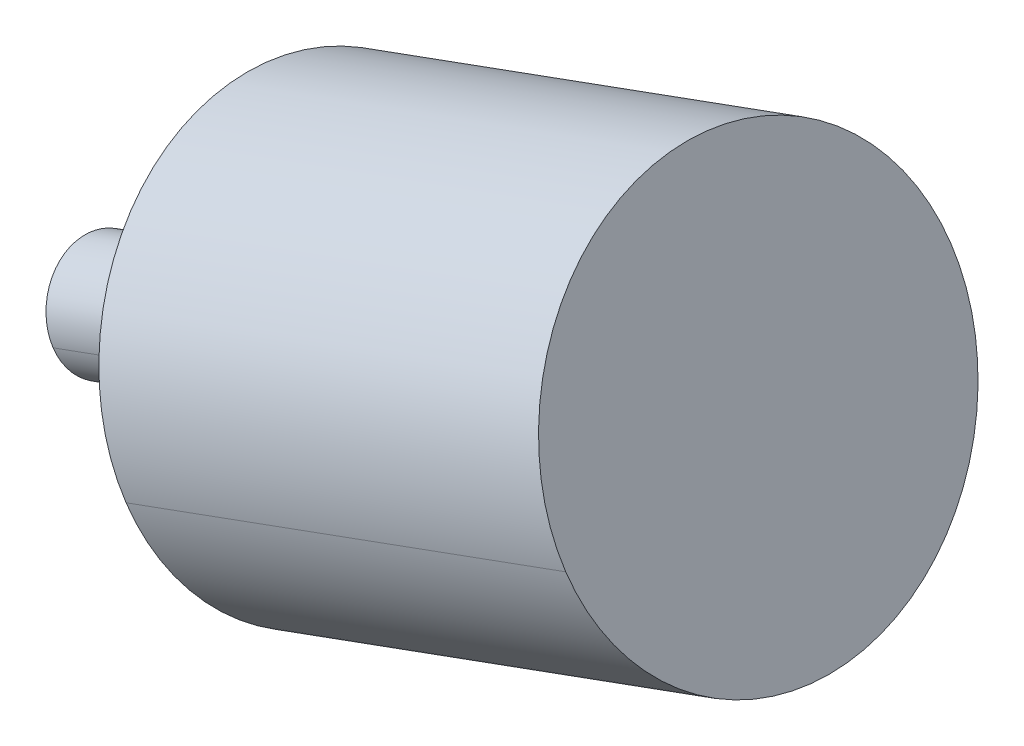
ISO-10303-21;
HEADER;
FILE_DESCRIPTION(('STEP AP214'),'2;1');
FILE_NAME('part.step','',(''),(''),'','','');
FILE_SCHEMA(('AUTOMOTIVE_DESIGN { 1 0 10303 214 1 1 1 1 }'));
ENDSEC;
DATA;
#1=APPLICATION_CONTEXT('core data for automotive mechanical design processes');
#2=APPLICATION_PROTOCOL_DEFINITION('international standard','automotive_design',2000,#1);
#3=PRODUCT_CONTEXT('',#1,'mechanical');
#4=PRODUCT('Part','Part','',(#3));
#5=PRODUCT_RELATED_PRODUCT_CATEGORY('part','',(#4));
#6=PRODUCT_DEFINITION_FORMATION('','',#4);
#7=PRODUCT_DEFINITION_CONTEXT('part definition',#1,'design');
#8=PRODUCT_DEFINITION('design','',#6,#7);
#9=PRODUCT_DEFINITION_SHAPE('','',#8);
#10=(LENGTH_UNIT() NAMED_UNIT(*) SI_UNIT(.MILLI.,.METRE.));
#11=(NAMED_UNIT(*) PLANE_ANGLE_UNIT() SI_UNIT($,.RADIAN.));
#12=(NAMED_UNIT(*) SI_UNIT($,.STERADIAN.) SOLID_ANGLE_UNIT());
#13=UNCERTAINTY_MEASURE_WITH_UNIT(LENGTH_MEASURE(1.E-05),#10,'distance_accuracy_value','');
#14=(GEOMETRIC_REPRESENTATION_CONTEXT(3) GLOBAL_UNCERTAINTY_ASSIGNED_CONTEXT((#13)) GLOBAL_UNIT_ASSIGNED_CONTEXT((#10,
#11,#12)) REPRESENTATION_CONTEXT('',''));
#15=CARTESIAN_POINT('',(0.,0.,0.));
#16=DIRECTION('',(0.,0.,1.));
#17=DIRECTION('',(1.,0.,0.));
#18=AXIS2_PLACEMENT_3D('',#15,#16,#17);
#19=CARTESIAN_POINT('',(1.21636447513984,17.2970954989233,255.59864258433));
#20=DIRECTION('',(0.93969262078591,0.342020143325663,0.));
#21=DIRECTION('',(-0.0590336096404953,0.162193509476162,-0.984991522002408));
#22=AXIS2_PLACEMENT_3D('',#19,#20,#21);
#23=CYLINDRICAL_SURFACE('',#22,5.25);
#24=CARTESIAN_POINT('',(1.21636447513984,17.2970954989233,255.59864258433));
#25=DIRECTION('',(-0.93969262078591,-0.342020143325663,0.));
#26=DIRECTION('',(0.0590336096404953,-0.162193509476162,0.984991522002408));
#27=AXIS2_PLACEMENT_3D('',#24,#25,#26);
#28=CIRCLE('',#27,5.25);
#29=CARTESIAN_POINT('',(1.52629092575245,16.4455795741735,260.769848074843));
#30=VERTEX_POINT('',#29);
#31=CARTESIAN_POINT('',(0.906438024527237,18.1486114236732,250.427437093817));
#32=VERTEX_POINT('',#31);
#33=EDGE_CURVE('E67',#30,#32,#28,.T.);
#34=ORIENTED_EDGE('',*,*,#33,.F.);
#35=DIRECTION('',(0.93969262078591,0.342020143325663,0.));
#36=VECTOR('',#35,1.);
#37=CARTESIAN_POINT('',(1.52629092575245,16.4455795741735,260.769848074843));
#38=LINE('',#37,#36);
#39=CARTESIAN_POINT('',(16.561372858327,21.9179018673841,260.769848074843));
#40=VERTEX_POINT('',#39);
#41=EDGE_CURVE('E11',#30,#40,#38,.T.);
#42=ORIENTED_EDGE('',*,*,#41,.T.);
#43=CARTESIAN_POINT('',(16.2514464077144,22.7694177921339,255.59864258433));
#44=DIRECTION('',(-0.93969262078591,-0.342020143325663,0.));
#45=DIRECTION('',(0.0590336096404953,-0.162193509476162,0.984991522002408));
#46=AXIS2_PLACEMENT_3D('',#43,#44,#45);
#47=CIRCLE('',#46,5.25);
#48=CARTESIAN_POINT('',(15.9415199571018,23.6209337168838,250.427437093817));
#49=VERTEX_POINT('',#48);
#50=EDGE_CURVE('E55',#40,#49,#47,.T.);
#51=ORIENTED_EDGE('',*,*,#50,.T.);
#52=DIRECTION('',(0.93969262078591,0.342020143325663,0.));
#53=VECTOR('',#52,1.);
#54=CARTESIAN_POINT('',(0.906438024527237,18.1486114236732,250.427437093817));
#55=LINE('',#54,#53);
#56=EDGE_CURVE('E161',#32,#49,#55,.T.);
#57=ORIENTED_EDGE('',*,*,#56,.F.);
#58=EDGE_LOOP('',(#34,#42,#51,#57));
#59=FACE_BOUND('',#58,.T.);
#60=ADVANCED_FACE('F44',(#59),#23,.T.);
#61=CARTESIAN_POINT('',(16.2514464077144,22.7694177921339,255.59864258433));
#62=DIRECTION('',(0.93969262078591,0.342020143325663,0.));
#63=DIRECTION('',(-0.0590336096404953,0.162193509476162,-0.984991522002408));
#64=AXIS2_PLACEMENT_3D('',#61,#62,#63);
#65=CYLINDRICAL_SURFACE('',#64,6.);
#66=CARTESIAN_POINT('',(16.2514464077144,22.7694177921339,255.59864258433));
#67=DIRECTION('',(-0.93969262078591,-0.342020143325663,0.));
#68=DIRECTION('',(0.0590336096404953,-0.162193509476162,0.984991522002408));
#69=AXIS2_PLACEMENT_3D('',#66,#67,#68);
#70=CIRCLE('',#69,6.);
#71=CARTESIAN_POINT('',(16.6056480655574,21.796256735277,261.508591716344));
#72=VERTEX_POINT('',#71);
#73=CARTESIAN_POINT('',(15.8972447498714,23.7425788489909,249.688693452316));
#74=VERTEX_POINT('',#73);
#75=EDGE_CURVE('E86',#72,#74,#70,.T.);
#76=ORIENTED_EDGE('',*,*,#75,.F.);
#77=DIRECTION('',(0.93969262078591,0.342020143325663,0.));
#78=VECTOR('',#77,1.);
#79=CARTESIAN_POINT('',(16.6056480655574,21.796256735277,261.508591716344));
#80=LINE('',#79,#78);
#81=CARTESIAN_POINT('',(22.2438037902729,23.8483775952309,261.508591716344));
#82=VERTEX_POINT('',#81);
#83=EDGE_CURVE('E179',#72,#82,#80,.T.);
#84=ORIENTED_EDGE('',*,*,#83,.T.);
#85=CARTESIAN_POINT('',(21.8896021324299,24.8215386520879,255.59864258433));
#86=DIRECTION('',(-0.93969262078591,-0.342020143325663,0.));
#87=DIRECTION('',(0.0590336096404953,-0.162193509476162,0.984991522002408));
#88=AXIS2_PLACEMENT_3D('',#85,#86,#87);
#89=CIRCLE('',#88,6.);
#90=CARTESIAN_POINT('',(21.5354004745869,25.7946997089449,249.688693452316));
#91=VERTEX_POINT('',#90);
#92=EDGE_CURVE('E100',#82,#91,#89,.T.);
#93=ORIENTED_EDGE('',*,*,#92,.T.);
#94=DIRECTION('',(0.93969262078591,0.342020143325663,0.));
#95=VECTOR('',#94,1.);
#96=CARTESIAN_POINT('',(15.8972447498714,23.7425788489909,249.688693452316));
#97=LINE('',#96,#95);
#98=EDGE_CURVE('E160',#74,#91,#97,.T.);
#99=ORIENTED_EDGE('',*,*,#98,.F.);
#100=EDGE_LOOP('',(#76,#84,#93,#99));
#101=FACE_BOUND('',#100,.T.);
#102=ADVANCED_FACE('F213',(#101),#65,.T.);
#103=CARTESIAN_POINT('',(21.8896021324299,24.8215386520879,255.59864258433));
#104=DIRECTION('',(0.93969262078591,0.342020143325663,0.));
#105=DIRECTION('',(-0.0590336096404953,0.162193509476162,-0.984991522002408));
#106=AXIS2_PLACEMENT_3D('',#103,#104,#105);
#107=CYLINDRICAL_SURFACE('',#106,20.);
#108=CARTESIAN_POINT('',(21.8896021324299,24.8215386520879,255.59864258433));
#109=DIRECTION('',(-0.93969262078591,-0.342020143325663,0.));
#110=DIRECTION('',(0.0590336096404953,-0.162193509476162,0.984991522002408));
#111=AXIS2_PLACEMENT_3D('',#108,#109,#110);
#112=CIRCLE('',#111,20.);
#113=CARTESIAN_POINT('',(23.0702743252398,21.5776684625647,275.298473024378));
#114=VERTEX_POINT('',#113);
#115=CARTESIAN_POINT('',(20.70892993962,28.0654088416112,235.898812144282));
#116=VERTEX_POINT('',#115);
#117=EDGE_CURVE('E138',#114,#116,#112,.T.);
#118=ORIENTED_EDGE('',*,*,#117,.F.);
#119=DIRECTION('',(0.93969262078591,0.342020143325663,0.));
#120=VECTOR('',#119,1.);
#121=CARTESIAN_POINT('',(23.0702743252398,21.5776684625647,275.298473024378));
#122=LINE('',#121,#120);
#123=CARTESIAN_POINT('',(65.3564422606057,36.9685749122195,275.298473024378));
#124=VERTEX_POINT('',#123);
#125=EDGE_CURVE('E134',#114,#124,#122,.T.);
#126=ORIENTED_EDGE('',*,*,#125,.T.);
#127=CARTESIAN_POINT('',(64.1757700677958,40.2124451017428,255.59864258433));
#128=DIRECTION('',(-0.93969262078591,-0.342020143325663,0.));
#129=DIRECTION('',(0.0590336096404953,-0.162193509476162,0.984991522002408));
#130=AXIS2_PLACEMENT_3D('',#127,#128,#129);
#131=CIRCLE('',#130,20.);
#132=CARTESIAN_POINT('',(62.9950978749859,43.456315291266,235.898812144282));
#133=VERTEX_POINT('',#132);
#134=EDGE_CURVE('E128',#124,#133,#131,.T.);
#135=ORIENTED_EDGE('',*,*,#134,.T.);
#136=DIRECTION('',(0.93969262078591,0.342020143325663,0.));
#137=VECTOR('',#136,1.);
#138=CARTESIAN_POINT('',(20.70892993962,28.0654088416112,235.898812144282));
#139=LINE('',#138,#137);
#140=EDGE_CURVE('E122',#116,#133,#139,.T.);
#141=ORIENTED_EDGE('',*,*,#140,.F.);
#142=EDGE_LOOP('',(#118,#126,#135,#141));
#143=FACE_BOUND('',#142,.T.);
#144=ADVANCED_FACE('F137',(#143),#107,.T.);
#145=CARTESIAN_POINT('',(21.8896021324299,24.8215386520879,255.59864258433));
#146=DIRECTION('',(0.93969262078591,0.342020143325663,0.));
#147=DIRECTION('',(-0.0590336096404953,0.162193509476162,-0.984991522002408));
#148=AXIS2_PLACEMENT_3D('',#145,#146,#147);
#149=CYLINDRICAL_SURFACE('',#148,20.);
#150=ORIENTED_EDGE('',*,*,#125,.F.);
#151=CARTESIAN_POINT('',(21.8896021324299,24.8215386520879,255.59864258433));
#152=DIRECTION('',(-0.93969262078591,-0.342020143325663,0.));
#153=DIRECTION('',(0.0590336096404953,-0.162193509476162,0.984991522002408));
#154=AXIS2_PLACEMENT_3D('',#151,#152,#153);
#155=CIRCLE('',#154,20.);
#156=EDGE_CURVE('E144',#116,#114,#155,.T.);
#157=ORIENTED_EDGE('',*,*,#156,.F.);
#158=ORIENTED_EDGE('',*,*,#140,.T.);
#159=CARTESIAN_POINT('',(64.1757700677958,40.2124451017428,255.59864258433));
#160=DIRECTION('',(-0.93969262078591,-0.342020143325663,0.));
#161=DIRECTION('',(0.0590336096404953,-0.162193509476162,0.984991522002408));
#162=AXIS2_PLACEMENT_3D('',#159,#160,#161);
#163=CIRCLE('',#162,20.);
#164=EDGE_CURVE('E131',#133,#124,#163,.T.);
#165=ORIENTED_EDGE('',*,*,#164,.T.);
#166=EDGE_LOOP('',(#150,#157,#158,#165));
#167=FACE_BOUND('',#166,.T.);
#168=ADVANCED_FACE('F142',(#167),#149,.T.);
#169=CARTESIAN_POINT('',(21.8896021324299,24.8215386520879,255.59864258433));
#170=DIRECTION('',(-0.93969262078591,-0.342020143325663,0.));
#171=DIRECTION('',(0.0590336096404953,-0.162193509476162,0.984991522002408));
#172=AXIS2_PLACEMENT_3D('',#169,#170,#171);
#173=PLANE('',#172);
#174=ORIENTED_EDGE('',*,*,#156,.T.);
#175=ORIENTED_EDGE('',*,*,#117,.T.);
#176=EDGE_LOOP('',(#174,#175));
#177=FACE_BOUND('',#176,.T.);
#178=CARTESIAN_POINT('',(21.8896021324299,24.8215386520879,255.59864258433));
#179=DIRECTION('',(-0.93969262078591,-0.342020143325663,0.));
#180=DIRECTION('',(0.0590336096404953,-0.162193509476162,0.984991522002408));
#181=AXIS2_PLACEMENT_3D('',#178,#179,#180);
#182=CIRCLE('',#181,6.);
#183=EDGE_CURVE('E156',#91,#82,#182,.T.);
#184=ORIENTED_EDGE('',*,*,#183,.F.);
#185=ORIENTED_EDGE('',*,*,#92,.F.);
#186=EDGE_LOOP('',(#184,#185));
#187=FACE_BOUND('',#186,.T.);
#188=ADVANCED_FACE('F218',(#177,#187),#173,.T.);
#189=CARTESIAN_POINT('',(64.1757700677958,40.2124451017428,255.59864258433));
#190=DIRECTION('',(-0.93969262078591,-0.342020143325663,0.));
#191=DIRECTION('',(0.0590336096404953,-0.162193509476162,0.984991522002408));
#192=AXIS2_PLACEMENT_3D('',#189,#190,#191);
#193=PLANE('',#192);
#194=ORIENTED_EDGE('',*,*,#164,.F.);
#195=ORIENTED_EDGE('',*,*,#134,.F.);
#196=EDGE_LOOP('',(#194,#195));
#197=FACE_BOUND('',#196,.T.);
#198=ADVANCED_FACE('F130',(#197),#193,.F.);
#199=CARTESIAN_POINT('',(16.2514464077144,22.7694177921339,255.59864258433));
#200=DIRECTION('',(0.93969262078591,0.342020143325663,0.));
#201=DIRECTION('',(-0.0590336096404953,0.162193509476162,-0.984991522002408));
#202=AXIS2_PLACEMENT_3D('',#199,#200,#201);
#203=CYLINDRICAL_SURFACE('',#202,6.);
#204=ORIENTED_EDGE('',*,*,#83,.F.);
#205=CARTESIAN_POINT('',(16.2514464077144,22.7694177921339,255.59864258433));
#206=DIRECTION('',(-0.93969262078591,-0.342020143325663,0.));
#207=DIRECTION('',(0.0590336096404953,-0.162193509476162,0.984991522002408));
#208=AXIS2_PLACEMENT_3D('',#205,#206,#207);
#209=CIRCLE('',#208,6.);
#210=EDGE_CURVE('E153',#74,#72,#209,.T.);
#211=ORIENTED_EDGE('',*,*,#210,.F.);
#212=ORIENTED_EDGE('',*,*,#98,.T.);
#213=ORIENTED_EDGE('',*,*,#183,.T.);
#214=EDGE_LOOP('',(#204,#211,#212,#213));
#215=FACE_BOUND('',#214,.T.);
#216=ADVANCED_FACE('F46',(#215),#203,.T.);
#217=CARTESIAN_POINT('',(16.2514464077144,22.7694177921339,255.59864258433));
#218=DIRECTION('',(-0.93969262078591,-0.342020143325663,0.));
#219=DIRECTION('',(0.0590336096404953,-0.162193509476162,0.984991522002408));
#220=AXIS2_PLACEMENT_3D('',#217,#218,#219);
#221=PLANE('',#220);
#222=ORIENTED_EDGE('',*,*,#210,.T.);
#223=ORIENTED_EDGE('',*,*,#75,.T.);
#224=EDGE_LOOP('',(#222,#223));
#225=FACE_BOUND('',#224,.T.);
#226=CARTESIAN_POINT('',(16.2514464077144,22.7694177921339,255.59864258433));
#227=DIRECTION('',(-0.93969262078591,-0.342020143325663,0.));
#228=DIRECTION('',(0.0590336096404953,-0.162193509476162,0.984991522002408));
#229=AXIS2_PLACEMENT_3D('',#226,#227,#228);
#230=CIRCLE('',#229,5.25);
#231=EDGE_CURVE('E48',#49,#40,#230,.T.);
#232=ORIENTED_EDGE('',*,*,#231,.F.);
#233=ORIENTED_EDGE('',*,*,#50,.F.);
#234=EDGE_LOOP('',(#232,#233));
#235=FACE_BOUND('',#234,.T.);
#236=ADVANCED_FACE('F205',(#225,#235),#221,.T.);
#237=CARTESIAN_POINT('',(1.21636447513984,17.2970954989233,255.59864258433));
#238=DIRECTION('',(0.93969262078591,0.342020143325663,0.));
#239=DIRECTION('',(-0.0590336096404953,0.162193509476162,-0.984991522002408));
#240=AXIS2_PLACEMENT_3D('',#237,#238,#239);
#241=CYLINDRICAL_SURFACE('',#240,5.25);
#242=ORIENTED_EDGE('',*,*,#41,.F.);
#243=CARTESIAN_POINT('',(1.21636447513984,17.2970954989233,255.59864258433));
#244=DIRECTION('',(-0.93969262078591,-0.342020143325663,0.));
#245=DIRECTION('',(0.0590336096404953,-0.162193509476162,0.984991522002408));
#246=AXIS2_PLACEMENT_3D('',#243,#244,#245);
#247=CIRCLE('',#246,5.25);
#248=EDGE_CURVE('E187',#32,#30,#247,.T.);
#249=ORIENTED_EDGE('',*,*,#248,.F.);
#250=ORIENTED_EDGE('',*,*,#56,.T.);
#251=ORIENTED_EDGE('',*,*,#231,.T.);
#252=EDGE_LOOP('',(#242,#249,#250,#251));
#253=FACE_BOUND('',#252,.T.);
#254=ADVANCED_FACE('F197',(#253),#241,.T.);
#255=CARTESIAN_POINT('',(1.21636447513984,17.2970954989233,255.59864258433));
#256=DIRECTION('',(-0.93969262078591,-0.342020143325663,0.));
#257=DIRECTION('',(0.0590336096404953,-0.162193509476162,0.984991522002408));
#258=AXIS2_PLACEMENT_3D('',#255,#256,#257);
#259=PLANE('',#258);
#260=ORIENTED_EDGE('',*,*,#248,.T.);
#261=ORIENTED_EDGE('',*,*,#33,.T.);
#262=EDGE_LOOP('',(#260,#261));
#263=FACE_BOUND('',#262,.T.);
#264=ADVANCED_FACE('F192',(#263),#259,.T.);
#265=CLOSED_SHELL('',(#60,#102,#144,#168,#188,#198,#216,#236,#254,#264));
#266=MANIFOLD_SOLID_BREP('B2',#265);
#267=ADVANCED_BREP_SHAPE_REPRESENTATION('',(#18,#266),#14);
#268=SHAPE_DEFINITION_REPRESENTATION(#9,#267);
ENDSEC;
END-ISO-10303-21;
